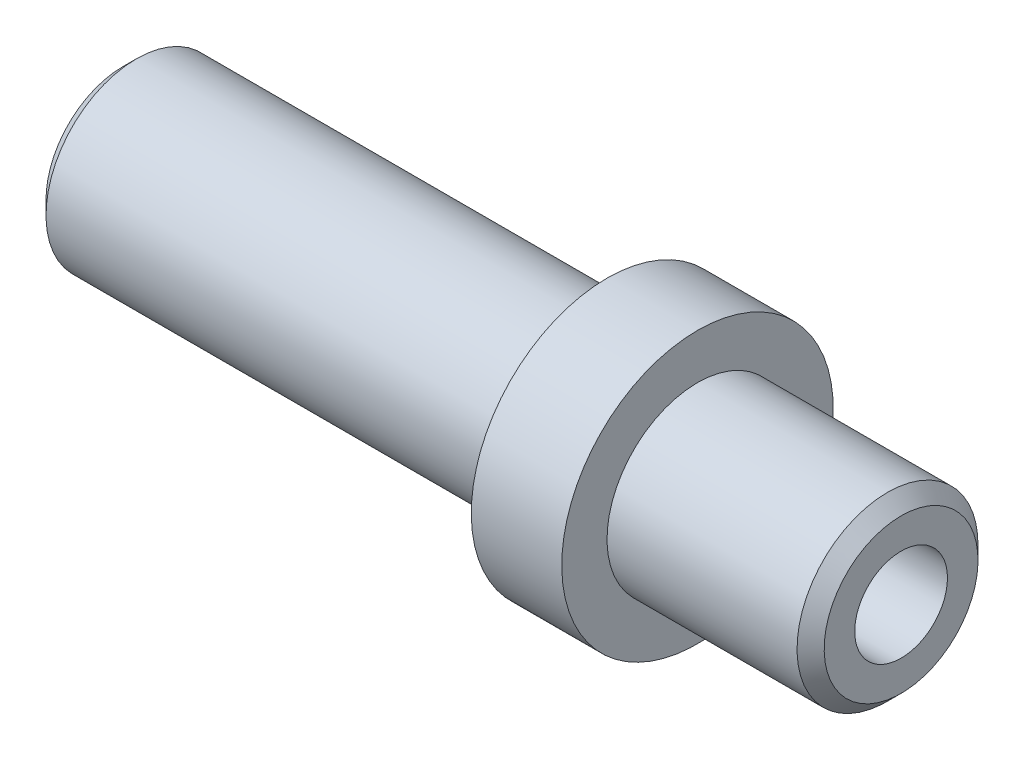
ISO-10303-21;
HEADER;
FILE_DESCRIPTION(('STEP AP214'),'2;1');
FILE_NAME('part.step','',(''),(''),'','','');
FILE_SCHEMA(('AUTOMOTIVE_DESIGN { 1 0 10303 214 1 1 1 1 }'));
ENDSEC;
DATA;
#1=APPLICATION_CONTEXT('core data for automotive mechanical design processes');
#2=APPLICATION_PROTOCOL_DEFINITION('international standard','automotive_design',2000,#1);
#3=PRODUCT_CONTEXT('',#1,'mechanical');
#4=PRODUCT('Part','Part','',(#3));
#5=PRODUCT_RELATED_PRODUCT_CATEGORY('part','',(#4));
#6=PRODUCT_DEFINITION_FORMATION('','',#4);
#7=PRODUCT_DEFINITION_CONTEXT('part definition',#1,'design');
#8=PRODUCT_DEFINITION('design','',#6,#7);
#9=PRODUCT_DEFINITION_SHAPE('','',#8);
#10=(LENGTH_UNIT() NAMED_UNIT(*) SI_UNIT(.MILLI.,.METRE.));
#11=(NAMED_UNIT(*) PLANE_ANGLE_UNIT() SI_UNIT($,.RADIAN.));
#12=(NAMED_UNIT(*) SI_UNIT($,.STERADIAN.) SOLID_ANGLE_UNIT());
#13=UNCERTAINTY_MEASURE_WITH_UNIT(LENGTH_MEASURE(1.E-05),#10,'distance_accuracy_value','');
#14=(GEOMETRIC_REPRESENTATION_CONTEXT(3) GLOBAL_UNCERTAINTY_ASSIGNED_CONTEXT((#13)) GLOBAL_UNIT_ASSIGNED_CONTEXT((#10,
#11,#12)) REPRESENTATION_CONTEXT('',''));
#15=CARTESIAN_POINT('',(0.,0.,0.));
#16=DIRECTION('',(0.,0.,1.));
#17=DIRECTION('',(1.,0.,0.));
#18=AXIS2_PLACEMENT_3D('',#15,#16,#17);
#19=CARTESIAN_POINT('',(0.,0.,0.));
#20=DIRECTION('',(-1.,0.,0.));
#21=DIRECTION('',(0.,-1.,0.));
#22=AXIS2_PLACEMENT_3D('',#19,#20,#21);
#23=PLANE('',#22);
#24=CARTESIAN_POINT('',(0.,0.,0.));
#25=DIRECTION('',(-1.,0.,0.));
#26=DIRECTION('',(0.,-1.,0.));
#27=AXIS2_PLACEMENT_3D('',#24,#25,#26);
#28=CIRCLE('',#27,1.69999999999999);
#29=CARTESIAN_POINT('',(0.,1.69999999999999,0.));
#30=VERTEX_POINT('',#29);
#31=EDGE_CURVE('E10',#30,#30,#28,.T.);
#32=ORIENTED_EDGE('',*,*,#31,.T.);
#33=EDGE_LOOP('',(#32));
#34=FACE_BOUND('',#33,.T.);
#35=CARTESIAN_POINT('',(0.,0.,0.));
#36=DIRECTION('',(-1.,0.,0.));
#37=DIRECTION('',(0.,0.,1.));
#38=AXIS2_PLACEMENT_3D('',#35,#36,#37);
#39=CIRCLE('',#38,1.025);
#40=CARTESIAN_POINT('',(0.,0.,1.025));
#41=VERTEX_POINT('',#40);
#42=EDGE_CURVE('E59',#41,#41,#39,.T.);
#43=ORIENTED_EDGE('',*,*,#42,.F.);
#44=EDGE_LOOP('',(#43));
#45=FACE_BOUND('',#44,.T.);
#46=ADVANCED_FACE('F35',(#34,#45),#23,.T.);
#47=CARTESIAN_POINT('',(17.2,0.,0.));
#48=DIRECTION('',(1.,0.,0.));
#49=DIRECTION('',(0.,1.,0.));
#50=AXIS2_PLACEMENT_3D('',#47,#48,#49);
#51=CYLINDRICAL_SURFACE('',#50,1.99999999999999);
#52=CARTESIAN_POINT('',(0.300000000000005,0.,0.));
#53=DIRECTION('',(-1.,0.,0.));
#54=DIRECTION('',(0.,-1.,0.));
#55=AXIS2_PLACEMENT_3D('',#52,#53,#54);
#56=CIRCLE('',#55,1.99999999999999);
#57=CARTESIAN_POINT('',(0.300000000000005,1.99999999999999,0.));
#58=VERTEX_POINT('',#57);
#59=EDGE_CURVE('E42',#58,#58,#56,.F.);
#60=ORIENTED_EDGE('',*,*,#59,.T.);
#61=EDGE_LOOP('',(#60));
#62=FACE_BOUND('',#61,.T.);
#63=CARTESIAN_POINT('',(10.7,0.,0.));
#64=DIRECTION('',(1.,0.,0.));
#65=DIRECTION('',(0.,1.,0.));
#66=AXIS2_PLACEMENT_3D('',#63,#64,#65);
#67=CIRCLE('',#66,2.);
#68=CARTESIAN_POINT('',(10.7,2.,0.));
#69=VERTEX_POINT('',#68);
#70=EDGE_CURVE('E55',#69,#69,#67,.T.);
#71=ORIENTED_EDGE('',*,*,#70,.F.);
#72=EDGE_LOOP('',(#71));
#73=FACE_BOUND('',#72,.T.);
#74=ADVANCED_FACE('F102',(#62,#73),#51,.T.);
#75=CARTESIAN_POINT('',(10.7,2.,0.));
#76=DIRECTION('',(-1.,0.,0.));
#77=DIRECTION('',(0.,-1.,0.));
#78=AXIS2_PLACEMENT_3D('',#75,#76,#77);
#79=PLANE('',#78);
#80=ORIENTED_EDGE('',*,*,#70,.T.);
#81=EDGE_LOOP('',(#80));
#82=FACE_BOUND('',#81,.T.);
#83=CARTESIAN_POINT('',(10.7,0.,0.));
#84=DIRECTION('',(1.,0.,0.));
#85=DIRECTION('',(0.,1.,0.));
#86=AXIS2_PLACEMENT_3D('',#83,#84,#85);
#87=CIRCLE('',#86,3.);
#88=CARTESIAN_POINT('',(10.7,3.,0.));
#89=VERTEX_POINT('',#88);
#90=EDGE_CURVE('E63',#89,#89,#87,.T.);
#91=ORIENTED_EDGE('',*,*,#90,.F.);
#92=EDGE_LOOP('',(#91));
#93=FACE_BOUND('',#92,.T.);
#94=ADVANCED_FACE('F107',(#82,#93),#79,.T.);
#95=CARTESIAN_POINT('',(17.2,0.,0.));
#96=DIRECTION('',(1.,0.,0.));
#97=DIRECTION('',(0.,1.,0.));
#98=AXIS2_PLACEMENT_3D('',#95,#96,#97);
#99=CYLINDRICAL_SURFACE('',#98,3.);
#100=ORIENTED_EDGE('',*,*,#90,.T.);
#101=EDGE_LOOP('',(#100));
#102=FACE_BOUND('',#101,.T.);
#103=CARTESIAN_POINT('',(12.7,0.,0.));
#104=DIRECTION('',(1.,0.,0.));
#105=DIRECTION('',(0.,1.,0.));
#106=AXIS2_PLACEMENT_3D('',#103,#104,#105);
#107=CIRCLE('',#106,3.);
#108=CARTESIAN_POINT('',(12.7,3.,0.));
#109=VERTEX_POINT('',#108);
#110=EDGE_CURVE('E66',#109,#109,#107,.T.);
#111=ORIENTED_EDGE('',*,*,#110,.F.);
#112=EDGE_LOOP('',(#111));
#113=FACE_BOUND('',#112,.T.);
#114=ADVANCED_FACE('F129',(#102,#113),#99,.T.);
#115=CARTESIAN_POINT('',(12.7,3.,0.));
#116=DIRECTION('',(1.,0.,0.));
#117=DIRECTION('',(0.,1.,0.));
#118=AXIS2_PLACEMENT_3D('',#115,#116,#117);
#119=PLANE('',#118);
#120=ORIENTED_EDGE('',*,*,#110,.T.);
#121=EDGE_LOOP('',(#120));
#122=FACE_BOUND('',#121,.T.);
#123=CARTESIAN_POINT('',(12.7,0.,0.));
#124=DIRECTION('',(1.,0.,0.));
#125=DIRECTION('',(0.,1.,0.));
#126=AXIS2_PLACEMENT_3D('',#123,#124,#125);
#127=CIRCLE('',#126,2.);
#128=CARTESIAN_POINT('',(12.7,2.,0.));
#129=VERTEX_POINT('',#128);
#130=EDGE_CURVE('E69',#129,#129,#127,.T.);
#131=ORIENTED_EDGE('',*,*,#130,.F.);
#132=EDGE_LOOP('',(#131));
#133=FACE_BOUND('',#132,.T.);
#134=ADVANCED_FACE('F98',(#122,#133),#119,.T.);
#135=CARTESIAN_POINT('',(17.2,0.,0.));
#136=DIRECTION('',(1.,0.,0.));
#137=DIRECTION('',(0.,1.,0.));
#138=AXIS2_PLACEMENT_3D('',#135,#136,#137);
#139=CYLINDRICAL_SURFACE('',#138,2.);
#140=CARTESIAN_POINT('',(16.9,0.,0.));
#141=DIRECTION('',(1.,0.,0.));
#142=DIRECTION('',(0.,1.,0.));
#143=AXIS2_PLACEMENT_3D('',#140,#141,#142);
#144=CIRCLE('',#143,2.);
#145=CARTESIAN_POINT('',(16.9,2.,0.));
#146=VERTEX_POINT('',#145);
#147=EDGE_CURVE('E46',#146,#146,#144,.F.);
#148=ORIENTED_EDGE('',*,*,#147,.T.);
#149=EDGE_LOOP('',(#148));
#150=FACE_BOUND('',#149,.T.);
#151=ORIENTED_EDGE('',*,*,#130,.T.);
#152=EDGE_LOOP('',(#151));
#153=FACE_BOUND('',#152,.T.);
#154=ADVANCED_FACE('F88',(#150,#153),#139,.T.);
#155=CARTESIAN_POINT('',(17.2,2.,0.));
#156=DIRECTION('',(1.,0.,0.));
#157=DIRECTION('',(0.,1.,0.));
#158=AXIS2_PLACEMENT_3D('',#155,#156,#157);
#159=PLANE('',#158);
#160=CARTESIAN_POINT('',(17.2,0.,0.));
#161=DIRECTION('',(1.,0.,0.));
#162=DIRECTION('',(0.,1.,0.));
#163=AXIS2_PLACEMENT_3D('',#160,#161,#162);
#164=CIRCLE('',#163,1.7);
#165=CARTESIAN_POINT('',(17.2,1.7,0.));
#166=VERTEX_POINT('',#165);
#167=EDGE_CURVE('E50',#166,#166,#164,.T.);
#168=ORIENTED_EDGE('',*,*,#167,.T.);
#169=EDGE_LOOP('',(#168));
#170=FACE_BOUND('',#169,.T.);
#171=CARTESIAN_POINT('',(17.2,0.,0.));
#172=DIRECTION('',(1.,0.,0.));
#173=DIRECTION('',(0.,0.,-1.));
#174=AXIS2_PLACEMENT_3D('',#171,#172,#173);
#175=CIRCLE('',#174,1.025);
#176=CARTESIAN_POINT('',(17.2,0.,-1.025));
#177=VERTEX_POINT('',#176);
#178=EDGE_CURVE('E79',#177,#177,#175,.T.);
#179=ORIENTED_EDGE('',*,*,#178,.F.);
#180=EDGE_LOOP('',(#179));
#181=FACE_BOUND('',#180,.T.);
#182=ADVANCED_FACE('F85',(#170,#181),#159,.T.);
#183=CARTESIAN_POINT('',(8.,0.,0.));
#184=DIRECTION('',(-1.,0.,0.));
#185=DIRECTION('',(0.,0.,1.));
#186=AXIS2_PLACEMENT_3D('',#183,#184,#185);
#187=CONICAL_SURFACE('',#186,1.025,1.02974425867665);
#188=CARTESIAN_POINT('',(8.6,0.,0.));
#189=DIRECTION('',(1.,0.,0.));
#190=DIRECTION('',(0.,0.,-1.));
#191=AXIS2_PLACEMENT_3D('',#188,#189,#190);
#192=CIRCLE('',#191,0.0264323105896939);
#193=CARTESIAN_POINT('',(8.6,0.,0.0264323105896949));
#194=VERTEX_POINT('',#193);
#195=EDGE_CURVE('E56',#194,#194,#192,.T.);
#196=CARTESIAN_POINT('',(8.,0.,0.));
#197=DIRECTION('',(-1.,0.,0.));
#198=DIRECTION('',(0.,0.,1.));
#199=AXIS2_PLACEMENT_3D('',#196,#197,#198);
#200=CIRCLE('',#199,1.025);
#201=CARTESIAN_POINT('',(8.,0.,1.025));
#202=VERTEX_POINT('',#201);
#203=EDGE_CURVE('E72',#202,#202,#200,.T.);
#204=CARTESIAN_POINT('',(8.6,0.,0.0264323105896949));
#205=CARTESIAN_POINT('',(8.59375,0.,0.0368340573543852));
#206=CARTESIAN_POINT('',(8.5875,0.,0.0472358041190759));
#207=CARTESIAN_POINT('',(8.575,0.,0.0680392976484573));
#208=CARTESIAN_POINT('',(8.56875,0.,0.078441044413148));
#209=CARTESIAN_POINT('',(8.55625,0.,0.0992445379425294));
#210=CARTESIAN_POINT('',(8.55,0.,0.10964628470722));
#211=CARTESIAN_POINT('',(8.5375,0.,0.130449778236601));
#212=CARTESIAN_POINT('',(8.53125,0.,0.140851525001292));
#213=CARTESIAN_POINT('',(8.51875,0.,0.161655018530673));
#214=CARTESIAN_POINT('',(8.5125,0.,0.172056765295364));
#215=CARTESIAN_POINT('',(8.5,0.,0.192860258824745));
#216=CARTESIAN_POINT('',(8.49375,0.,0.203262005589436));
#217=CARTESIAN_POINT('',(8.48125,0.,0.224065499118817));
#218=CARTESIAN_POINT('',(8.475,0.,0.234467245883508));
#219=CARTESIAN_POINT('',(8.4625,0.,0.255270739412889));
#220=CARTESIAN_POINT('',(8.45625,0.,0.265672486177579));
#221=CARTESIAN_POINT('',(8.44375,0.,0.286475979706961));
#222=CARTESIAN_POINT('',(8.4375,0.,0.296877726471651));
#223=CARTESIAN_POINT('',(8.425,0.,0.317681220001033));
#224=CARTESIAN_POINT('',(8.41875,0.,0.328082966765723));
#225=CARTESIAN_POINT('',(8.40625,0.,0.348886460295105));
#226=CARTESIAN_POINT('',(8.4,0.,0.359288207059795));
#227=CARTESIAN_POINT('',(8.3875,0.,0.380091700589177));
#228=CARTESIAN_POINT('',(8.38125,0.,0.390493447353867));
#229=CARTESIAN_POINT('',(8.36875,0.,0.411296940883248));
#230=CARTESIAN_POINT('',(8.3625,0.,0.421698687647939));
#231=CARTESIAN_POINT('',(8.35,0.,0.44250218117732));
#232=CARTESIAN_POINT('',(8.34375,0.,0.452903927942011));
#233=CARTESIAN_POINT('',(8.33125,0.,0.473707421471392));
#234=CARTESIAN_POINT('',(8.325,0.,0.484109168236083));
#235=CARTESIAN_POINT('',(8.3125,0.,0.504912661765464));
#236=CARTESIAN_POINT('',(8.30625,0.,0.515314408530155));
#237=CARTESIAN_POINT('',(8.29375,0.,0.536117902059536));
#238=CARTESIAN_POINT('',(8.2875,0.,0.546519648824227));
#239=CARTESIAN_POINT('',(8.275,0.,0.567323142353608));
#240=CARTESIAN_POINT('',(8.26875,0.,0.577724889118299));
#241=CARTESIAN_POINT('',(8.25625,0.,0.59852838264768));
#242=CARTESIAN_POINT('',(8.25,0.,0.608930129412371));
#243=CARTESIAN_POINT('',(8.2375,0.,0.629733622941752));
#244=CARTESIAN_POINT('',(8.23125,0.,0.640135369706442));
#245=CARTESIAN_POINT('',(8.21875,0.,0.660938863235824));
#246=CARTESIAN_POINT('',(8.2125,0.,0.671340610000514));
#247=CARTESIAN_POINT('',(8.2,0.,0.692144103529896));
#248=CARTESIAN_POINT('',(8.19375,0.,0.702545850294586));
#249=CARTESIAN_POINT('',(8.18125,0.,0.723349343823968));
#250=CARTESIAN_POINT('',(8.175,0.,0.733751090588658));
#251=CARTESIAN_POINT('',(8.1625,0.,0.754554584118039));
#252=CARTESIAN_POINT('',(8.15625,0.,0.76495633088273));
#253=CARTESIAN_POINT('',(8.14375,0.,0.785759824412111));
#254=CARTESIAN_POINT('',(8.1375,0.,0.796161571176802));
#255=CARTESIAN_POINT('',(8.125,0.,0.816965064706183));
#256=CARTESIAN_POINT('',(8.11875,0.,0.827366811470874));
#257=CARTESIAN_POINT('',(8.10625,0.,0.848170305000255));
#258=CARTESIAN_POINT('',(8.1,0.,0.858572051764946));
#259=CARTESIAN_POINT('',(8.0875,0.,0.879375545294327));
#260=CARTESIAN_POINT('',(8.08125,0.,0.889777292059018));
#261=CARTESIAN_POINT('',(8.06875,0.,0.910580785588399));
#262=CARTESIAN_POINT('',(8.0625,0.,0.92098253235309));
#263=CARTESIAN_POINT('',(8.05,0.,0.941786025882471));
#264=CARTESIAN_POINT('',(8.04375,0.,0.952187772647161));
#265=CARTESIAN_POINT('',(8.03125,0.,0.972991266176543));
#266=CARTESIAN_POINT('',(8.025,0.,0.983393012941233));
#267=CARTESIAN_POINT('',(8.0125,0.,1.00419650647061));
#268=CARTESIAN_POINT('',(8.00625,0.,1.01459825323531));
#269=CARTESIAN_POINT('',(8.,0.,1.025));
#270=B_SPLINE_CURVE_WITH_KNOTS('',3,(#204,#205,#206,#207,#208,#209,#210,#211,#212,#213,#214,
#215,#216,#217,#218,#219,#220,#221,#222,#223,#224,#225,#226,#227,#228,#229,#230,#231,#232,#233,
#234,#235,#236,#237,#238,#239,#240,#241,#242,#243,#244,#245,#246,#247,#248,#249,#250,#251,#252,
#253,#254,#255,#256,#257,#258,#259,#260,#261,#262,#263,#264,#265,#266,#267,#268,#269),
.UNSPECIFIED.,.F.,.F.,(4,2,2,2,2,2,2,2,2,2,2,2,2,2,2,2,2,2,2,2,2,2,2,2,2,2,2,2,2,2,2,2,4),(0.,
0.0364050754951946,0.0728101509903884,0.109215226485582,0.145620301980776,0.18202537747597,
0.218430452971163,0.254835528466358,0.291240603961552,0.327645679456746,0.364050754951939,
0.400455830447133,0.436860905942327,0.473265981437522,0.509671056932715,0.546076132427909,
0.582481207923103,0.618886283418297,0.65529135891349,0.691696434408684,0.728101509903879,
0.764506585399072,0.800911660894266,0.83731673638946,0.873721811884653,0.910126887379847,
0.946531962875042,0.982937038370236,1.01934211386543,1.05574718936062,1.09215226485582,
1.12855734035101,1.16496241584621),.UNSPECIFIED.);
#271=EDGE_CURVE('BSEAM87',#194,#202,#270,.T.);
#272=ORIENTED_EDGE('',*,*,#195,.T.);
#273=ORIENTED_EDGE('',*,*,#203,.T.);
#274=ORIENTED_EDGE('',*,*,#271,.T.);
#275=ORIENTED_EDGE('',*,*,#271,.F.);
#276=EDGE_LOOP('',(#272,#274,#273,#275));
#277=FACE_BOUND('',#276,.T.);
#278=ADVANCED_FACE('F87',(#277),#187,.F.);
#279=CARTESIAN_POINT('',(0.,0.,0.));
#280=DIRECTION('',(-1.,0.,0.));
#281=DIRECTION('',(0.,0.,1.));
#282=AXIS2_PLACEMENT_3D('',#279,#280,#281);
#283=CYLINDRICAL_SURFACE('',#282,1.025);
#284=ORIENTED_EDGE('',*,*,#203,.F.);
#285=EDGE_LOOP('',(#284));
#286=FACE_BOUND('',#285,.T.);
#287=ORIENTED_EDGE('',*,*,#42,.T.);
#288=EDGE_LOOP('',(#287));
#289=FACE_BOUND('',#288,.T.);
#290=ADVANCED_FACE('F95',(#286,#289),#283,.F.);
#291=CARTESIAN_POINT('',(9.2,0.,0.));
#292=DIRECTION('',(1.,0.,0.));
#293=DIRECTION('',(0.,0.,-1.));
#294=AXIS2_PLACEMENT_3D('',#291,#292,#293);
#295=CONICAL_SURFACE('',#294,1.025,1.02974425867665);
#296=CARTESIAN_POINT('',(9.2,0.,0.));
#297=DIRECTION('',(1.,0.,0.));
#298=DIRECTION('',(0.,0.,-1.));
#299=AXIS2_PLACEMENT_3D('',#296,#297,#298);
#300=CIRCLE('',#299,1.025);
#301=CARTESIAN_POINT('',(9.2,0.,-1.025));
#302=VERTEX_POINT('',#301);
#303=EDGE_CURVE('E60',#302,#302,#300,.T.);
#304=ORIENTED_EDGE('',*,*,#303,.T.);
#305=EDGE_LOOP('',(#304));
#306=FACE_BOUND('',#305,.T.);
#307=ORIENTED_EDGE('',*,*,#195,.F.);
#308=EDGE_LOOP('',(#307));
#309=FACE_BOUND('',#308,.T.);
#310=ADVANCED_FACE('F119',(#306,#309),#295,.F.);
#311=CARTESIAN_POINT('',(17.2,0.,0.));
#312=DIRECTION('',(1.,0.,0.));
#313=DIRECTION('',(0.,0.,-1.));
#314=AXIS2_PLACEMENT_3D('',#311,#312,#313);
#315=CYLINDRICAL_SURFACE('',#314,1.025);
#316=ORIENTED_EDGE('',*,*,#303,.F.);
#317=EDGE_LOOP('',(#316));
#318=FACE_BOUND('',#317,.T.);
#319=ORIENTED_EDGE('',*,*,#178,.T.);
#320=EDGE_LOOP('',(#319));
#321=FACE_BOUND('',#320,.T.);
#322=ADVANCED_FACE('F83',(#318,#321),#315,.F.);
#323=CARTESIAN_POINT('',(17.2,0.,0.));
#324=DIRECTION('',(-1.,0.,0.));
#325=DIRECTION('',(0.,-1.,0.));
#326=AXIS2_PLACEMENT_3D('',#323,#324,#325);
#327=CONICAL_SURFACE('',#326,1.7,0.785398163397445);
#328=ORIENTED_EDGE('',*,*,#147,.F.);
#329=EDGE_LOOP('',(#328));
#330=FACE_BOUND('',#329,.T.);
#331=ORIENTED_EDGE('',*,*,#167,.F.);
#332=EDGE_LOOP('',(#331));
#333=FACE_BOUND('',#332,.T.);
#334=ADVANCED_FACE('F111',(#330,#333),#327,.T.);
#335=CARTESIAN_POINT('',(0.300000000000005,0.,0.));
#336=DIRECTION('',(1.,0.,0.));
#337=DIRECTION('',(0.,1.,0.));
#338=AXIS2_PLACEMENT_3D('',#335,#336,#337);
#339=CONICAL_SURFACE('',#338,1.99999999999999,0.785398163397449);
#340=CARTESIAN_POINT('',(0.,1.69999999999999,0.));
#341=CARTESIAN_POINT('',(0.00312500000000006,1.70312499999999,0.));
#342=CARTESIAN_POINT('',(0.00625000000000009,1.70624999999999,0.));
#343=CARTESIAN_POINT('',(0.0125000000000002,1.71249999999999,0.));
#344=CARTESIAN_POINT('',(0.0156250000000002,1.71562499999999,0.));
#345=CARTESIAN_POINT('',(0.0218750000000003,1.72187499999999,0.));
#346=CARTESIAN_POINT('',(0.0250000000000004,1.72499999999999,0.));
#347=CARTESIAN_POINT('',(0.0312500000000005,1.73124999999999,0.));
#348=CARTESIAN_POINT('',(0.0343750000000005,1.73437499999999,0.));
#349=CARTESIAN_POINT('',(0.0406250000000006,1.74062499999999,0.));
#350=CARTESIAN_POINT('',(0.0437500000000007,1.74374999999999,0.));
#351=CARTESIAN_POINT('',(0.0500000000000008,1.74999999999999,0.));
#352=CARTESIAN_POINT('',(0.0531250000000008,1.75312499999999,0.));
#353=CARTESIAN_POINT('',(0.0593750000000009,1.75937499999999,0.));
#354=CARTESIAN_POINT('',(0.0625000000000009,1.76249999999999,0.));
#355=CARTESIAN_POINT('',(0.0687500000000011,1.76874999999999,0.));
#356=CARTESIAN_POINT('',(0.0718750000000011,1.77187499999999,0.));
#357=CARTESIAN_POINT('',(0.0781250000000012,1.77812499999999,0.));
#358=CARTESIAN_POINT('',(0.0812500000000013,1.78124999999999,0.));
#359=CARTESIAN_POINT('',(0.0875000000000014,1.78749999999999,0.));
#360=CARTESIAN_POINT('',(0.0906250000000014,1.79062499999999,0.));
#361=CARTESIAN_POINT('',(0.0968750000000015,1.79687499999999,0.));
#362=CARTESIAN_POINT('',(0.100000000000002,1.79999999999999,0.));
#363=CARTESIAN_POINT('',(0.106250000000002,1.80624999999999,0.));
#364=CARTESIAN_POINT('',(0.109375000000002,1.80937499999999,0.));
#365=CARTESIAN_POINT('',(0.115625000000002,1.81562499999999,0.));
#366=CARTESIAN_POINT('',(0.118750000000002,1.81874999999999,0.));
#367=CARTESIAN_POINT('',(0.125000000000002,1.82499999999999,0.));
#368=CARTESIAN_POINT('',(0.128125000000002,1.82812499999999,0.));
#369=CARTESIAN_POINT('',(0.134375000000002,1.83437499999999,0.));
#370=CARTESIAN_POINT('',(0.137500000000002,1.83749999999999,0.));
#371=CARTESIAN_POINT('',(0.143750000000002,1.84374999999999,0.));
#372=CARTESIAN_POINT('',(0.146875000000002,1.84687499999999,0.));
#373=CARTESIAN_POINT('',(0.153125000000002,1.85312499999999,0.));
#374=CARTESIAN_POINT('',(0.156250000000002,1.85624999999999,0.));
#375=CARTESIAN_POINT('',(0.162500000000003,1.86249999999999,0.));
#376=CARTESIAN_POINT('',(0.165625000000003,1.86562499999999,0.));
#377=CARTESIAN_POINT('',(0.171875000000003,1.87187499999999,0.));
#378=CARTESIAN_POINT('',(0.175000000000003,1.87499999999999,0.));
#379=CARTESIAN_POINT('',(0.181250000000003,1.88124999999999,0.));
#380=CARTESIAN_POINT('',(0.184375000000003,1.88437499999999,0.));
#381=CARTESIAN_POINT('',(0.190625000000003,1.89062499999999,0.));
#382=CARTESIAN_POINT('',(0.193750000000003,1.89374999999999,0.));
#383=CARTESIAN_POINT('',(0.200000000000003,1.89999999999999,0.));
#384=CARTESIAN_POINT('',(0.203125000000003,1.90312499999999,0.));
#385=CARTESIAN_POINT('',(0.209375000000003,1.90937499999999,0.));
#386=CARTESIAN_POINT('',(0.212500000000003,1.91249999999999,0.));
#387=CARTESIAN_POINT('',(0.218750000000003,1.91874999999999,0.));
#388=CARTESIAN_POINT('',(0.221875000000004,1.92187499999999,0.));
#389=CARTESIAN_POINT('',(0.228125000000004,1.92812499999999,0.));
#390=CARTESIAN_POINT('',(0.231250000000004,1.93124999999999,0.));
#391=CARTESIAN_POINT('',(0.237500000000004,1.93749999999999,0.));
#392=CARTESIAN_POINT('',(0.240625000000004,1.94062499999999,0.));
#393=CARTESIAN_POINT('',(0.246875000000004,1.94687499999999,0.));
#394=CARTESIAN_POINT('',(0.250000000000004,1.94999999999999,0.));
#395=CARTESIAN_POINT('',(0.256250000000004,1.95624999999999,0.));
#396=CARTESIAN_POINT('',(0.259375000000004,1.95937499999999,0.));
#397=CARTESIAN_POINT('',(0.265625000000004,1.96562499999999,0.));
#398=CARTESIAN_POINT('',(0.268750000000004,1.96874999999999,0.));
#399=CARTESIAN_POINT('',(0.275000000000004,1.97499999999999,0.));
#400=CARTESIAN_POINT('',(0.278125000000005,1.97812499999999,0.));
#401=CARTESIAN_POINT('',(0.284375000000005,1.98437499999999,0.));
#402=CARTESIAN_POINT('',(0.287500000000005,1.98749999999999,0.));
#403=CARTESIAN_POINT('',(0.293750000000005,1.99374999999999,0.));
#404=CARTESIAN_POINT('',(0.296875000000005,1.99687499999999,0.));
#405=CARTESIAN_POINT('',(0.300000000000005,1.99999999999999,0.));
#406=B_SPLINE_CURVE_WITH_KNOTS('',3,(#340,#341,#342,#343,#344,#345,#346,#347,#348,#349,#350,
#351,#352,#353,#354,#355,#356,#357,#358,#359,#360,#361,#362,#363,#364,#365,#366,#367,#368,#369,
#370,#371,#372,#373,#374,#375,#376,#377,#378,#379,#380,#381,#382,#383,#384,#385,#386,#387,#388,
#389,#390,#391,#392,#393,#394,#395,#396,#397,#398,#399,#400,#401,#402,#403,#404,#405),
.UNSPECIFIED.,.F.,.F.,(4,2,2,2,2,2,2,2,2,2,2,2,2,2,2,2,2,2,2,2,2,2,2,2,2,2,2,2,2,2,2,2,4),(0.,
0.0132582521472479,0.026516504294496,0.0397747564417439,0.053033008588992,0.0662912607362399,
0.0795495128834879,0.0928077650307358,0.106066017177984,0.119324269325232,0.13258252147248,
0.145840773619728,0.159099025766976,0.172357277914224,0.185615530061472,0.19887378220872,
0.212132034355968,0.225390286503216,0.238648538650464,0.251906790797712,0.26516504294496,
0.278423295092208,0.291681547239456,0.304939799386704,0.318198051533952,0.3314563036812,
0.344714555828448,0.357972807975696,0.371231060122944,0.384489312270192,0.397747564417439,
0.411005816564688,0.424264068711936),.UNSPECIFIED.);
#407=EDGE_CURVE('BSEAM37',#30,#58,#406,.T.);
#408=ORIENTED_EDGE('',*,*,#31,.F.);
#409=ORIENTED_EDGE('',*,*,#59,.F.);
#410=ORIENTED_EDGE('',*,*,#407,.T.);
#411=ORIENTED_EDGE('',*,*,#407,.F.);
#412=EDGE_LOOP('',(#408,#410,#409,#411));
#413=FACE_BOUND('',#412,.T.);
#414=ADVANCED_FACE('F37',(#413),#339,.T.);
#415=CLOSED_SHELL('',(#46,#74,#94,#114,#134,#154,#182,#278,#290,#310,#322,#334,#414));
#416=MANIFOLD_SOLID_BREP('B2',#415);
#417=ADVANCED_BREP_SHAPE_REPRESENTATION('',(#18,#416),#14);
#418=SHAPE_DEFINITION_REPRESENTATION(#9,#417);
ENDSEC;
END-ISO-10303-21;
